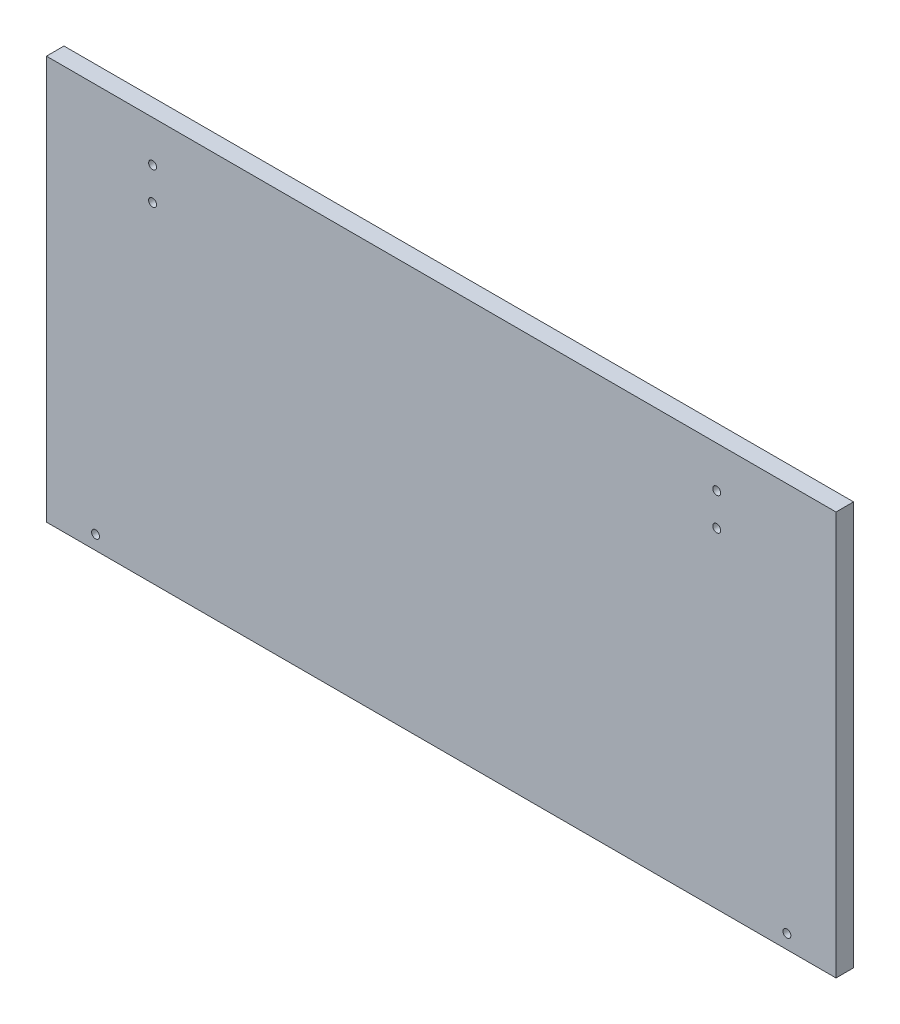
ISO-10303-21;
HEADER;
FILE_DESCRIPTION(('STEP AP214'),'2;1');
FILE_NAME('part.step','',(''),(''),'','','');
FILE_SCHEMA(('AUTOMOTIVE_DESIGN { 1 0 10303 214 1 1 1 1 }'));
ENDSEC;
DATA;
#1=APPLICATION_CONTEXT('core data for automotive mechanical design processes');
#2=APPLICATION_PROTOCOL_DEFINITION('international standard','automotive_design',2000,#1);
#3=PRODUCT_CONTEXT('',#1,'mechanical');
#4=PRODUCT('Part','Part','',(#3));
#5=PRODUCT_RELATED_PRODUCT_CATEGORY('part','',(#4));
#6=PRODUCT_DEFINITION_FORMATION('','',#4);
#7=PRODUCT_DEFINITION_CONTEXT('part definition',#1,'design');
#8=PRODUCT_DEFINITION('design','',#6,#7);
#9=PRODUCT_DEFINITION_SHAPE('','',#8);
#10=(LENGTH_UNIT() NAMED_UNIT(*) SI_UNIT(.MILLI.,.METRE.));
#11=(NAMED_UNIT(*) PLANE_ANGLE_UNIT() SI_UNIT($,.RADIAN.));
#12=(NAMED_UNIT(*) SI_UNIT($,.STERADIAN.) SOLID_ANGLE_UNIT());
#13=UNCERTAINTY_MEASURE_WITH_UNIT(LENGTH_MEASURE(1.E-05),#10,'distance_accuracy_value','');
#14=(GEOMETRIC_REPRESENTATION_CONTEXT(3) GLOBAL_UNCERTAINTY_ASSIGNED_CONTEXT((#13)) GLOBAL_UNIT_ASSIGNED_CONTEXT((#10,
#11,#12)) REPRESENTATION_CONTEXT('',''));
#15=CARTESIAN_POINT('',(0.,0.,0.));
#16=DIRECTION('',(0.,0.,1.));
#17=DIRECTION('',(1.,0.,0.));
#18=AXIS2_PLACEMENT_3D('',#15,#16,#17);
#19=CARTESIAN_POINT('',(-225.,115.,10.));
#20=DIRECTION('',(1.,0.,0.));
#21=DIRECTION('',(0.,1.,0.));
#22=AXIS2_PLACEMENT_3D('',#19,#20,#21);
#23=PLANE('',#22);
#24=DIRECTION('',(0.,-1.,0.));
#25=VECTOR('',#24,1.);
#26=CARTESIAN_POINT('',(-225.,115.,0.));
#27=LINE('',#26,#25);
#28=CARTESIAN_POINT('',(-225.,115.,0.));
#29=VERTEX_POINT('',#28);
#30=CARTESIAN_POINT('',(-225.,-115.,0.));
#31=VERTEX_POINT('',#30);
#32=EDGE_CURVE('E104',#29,#31,#27,.T.);
#33=ORIENTED_EDGE('',*,*,#32,.T.);
#34=DIRECTION('',(0.,0.,-1.));
#35=VECTOR('',#34,1.);
#36=CARTESIAN_POINT('',(-225.,-115.,10.));
#37=LINE('',#36,#35);
#38=CARTESIAN_POINT('',(-225.,-115.,10.));
#39=VERTEX_POINT('',#38);
#40=EDGE_CURVE('E11',#39,#31,#37,.T.);
#41=ORIENTED_EDGE('',*,*,#40,.F.);
#42=DIRECTION('',(0.,-1.,0.));
#43=VECTOR('',#42,1.);
#44=CARTESIAN_POINT('',(-225.,115.,10.));
#45=LINE('',#44,#43);
#46=CARTESIAN_POINT('',(-225.,115.,10.));
#47=VERTEX_POINT('',#46);
#48=EDGE_CURVE('E92',#47,#39,#45,.T.);
#49=ORIENTED_EDGE('',*,*,#48,.F.);
#50=DIRECTION('',(0.,0.,-1.));
#51=VECTOR('',#50,1.);
#52=CARTESIAN_POINT('',(-225.,115.,10.));
#53=LINE('',#52,#51);
#54=EDGE_CURVE('E100',#47,#29,#53,.T.);
#55=ORIENTED_EDGE('',*,*,#54,.T.);
#56=EDGE_LOOP('',(#33,#41,#49,#55));
#57=FACE_BOUND('',#56,.T.);
#58=ADVANCED_FACE('F41',(#57),#23,.F.);
#59=CARTESIAN_POINT('',(-225.,-115.,10.));
#60=DIRECTION('',(0.,1.,0.));
#61=DIRECTION('',(0.,0.,1.));
#62=AXIS2_PLACEMENT_3D('',#59,#60,#61);
#63=PLANE('',#62);
#64=DIRECTION('',(1.,0.,0.));
#65=VECTOR('',#64,1.);
#66=CARTESIAN_POINT('',(-225.,-115.,0.));
#67=LINE('',#66,#65);
#68=CARTESIAN_POINT('',(225.,-115.,0.));
#69=VERTEX_POINT('',#68);
#70=EDGE_CURVE('E96',#31,#69,#67,.T.);
#71=ORIENTED_EDGE('',*,*,#70,.T.);
#72=DIRECTION('',(0.,0.,-1.));
#73=VECTOR('',#72,1.);
#74=CARTESIAN_POINT('',(225.,-115.,10.));
#75=LINE('',#74,#73);
#76=CARTESIAN_POINT('',(225.,-115.,10.));
#77=VERTEX_POINT('',#76);
#78=EDGE_CURVE('E49',#77,#69,#75,.T.);
#79=ORIENTED_EDGE('',*,*,#78,.F.);
#80=DIRECTION('',(1.,0.,0.));
#81=VECTOR('',#80,1.);
#82=CARTESIAN_POINT('',(-225.,-115.,10.));
#83=LINE('',#82,#81);
#84=EDGE_CURVE('E87',#39,#77,#83,.T.);
#85=ORIENTED_EDGE('',*,*,#84,.F.);
#86=ORIENTED_EDGE('',*,*,#40,.T.);
#87=EDGE_LOOP('',(#71,#79,#85,#86));
#88=FACE_BOUND('',#87,.T.);
#89=ADVANCED_FACE('F95',(#88),#63,.F.);
#90=CARTESIAN_POINT('',(225.,115.,10.));
#91=DIRECTION('',(-1.,0.,0.));
#92=DIRECTION('',(0.,-1.,0.));
#93=AXIS2_PLACEMENT_3D('',#90,#91,#92);
#94=PLANE('',#93);
#95=DIRECTION('',(0.,1.,0.));
#96=VECTOR('',#95,1.);
#97=CARTESIAN_POINT('',(225.,115.,0.));
#98=LINE('',#97,#96);
#99=CARTESIAN_POINT('',(225.,115.,0.));
#100=VERTEX_POINT('',#99);
#101=EDGE_CURVE('E74',#69,#100,#98,.T.);
#102=ORIENTED_EDGE('',*,*,#101,.T.);
#103=DIRECTION('',(0.,0.,-1.));
#104=VECTOR('',#103,1.);
#105=CARTESIAN_POINT('',(225.,115.,10.));
#106=LINE('',#105,#104);
#107=CARTESIAN_POINT('',(225.,115.,10.));
#108=VERTEX_POINT('',#107);
#109=EDGE_CURVE('E97',#108,#100,#106,.T.);
#110=ORIENTED_EDGE('',*,*,#109,.F.);
#111=DIRECTION('',(0.,1.,0.));
#112=VECTOR('',#111,1.);
#113=CARTESIAN_POINT('',(225.,115.,10.));
#114=LINE('',#113,#112);
#115=EDGE_CURVE('E90',#77,#108,#114,.T.);
#116=ORIENTED_EDGE('',*,*,#115,.F.);
#117=ORIENTED_EDGE('',*,*,#78,.T.);
#118=EDGE_LOOP('',(#102,#110,#116,#117));
#119=FACE_BOUND('',#118,.T.);
#120=ADVANCED_FACE('F98',(#119),#94,.F.);
#121=CARTESIAN_POINT('',(-225.,115.,10.));
#122=DIRECTION('',(0.,-1.,0.));
#123=DIRECTION('',(0.,0.,-1.));
#124=AXIS2_PLACEMENT_3D('',#121,#122,#123);
#125=PLANE('',#124);
#126=DIRECTION('',(-1.,0.,0.));
#127=VECTOR('',#126,1.);
#128=CARTESIAN_POINT('',(-225.,115.,0.));
#129=LINE('',#128,#127);
#130=EDGE_CURVE('E80',#100,#29,#129,.T.);
#131=ORIENTED_EDGE('',*,*,#130,.T.);
#132=ORIENTED_EDGE('',*,*,#54,.F.);
#133=DIRECTION('',(-1.,0.,0.));
#134=VECTOR('',#133,1.);
#135=CARTESIAN_POINT('',(-225.,115.,10.));
#136=LINE('',#135,#134);
#137=EDGE_CURVE('E57',#108,#47,#136,.T.);
#138=ORIENTED_EDGE('',*,*,#137,.F.);
#139=ORIENTED_EDGE('',*,*,#109,.T.);
#140=EDGE_LOOP('',(#131,#132,#138,#139));
#141=FACE_BOUND('',#140,.T.);
#142=ADVANCED_FACE('F112',(#141),#125,.F.);
#143=CARTESIAN_POINT('',(0.,0.,10.));
#144=DIRECTION('',(0.,0.,1.));
#145=DIRECTION('',(1.,0.,0.));
#146=AXIS2_PLACEMENT_3D('',#143,#144,#145);
#147=PLANE('',#146);
#148=CARTESIAN_POINT('',(-197.,-107.,10.));
#149=DIRECTION('',(0.,0.,-1.));
#150=DIRECTION('',(-1.,0.,0.));
#151=AXIS2_PLACEMENT_3D('',#148,#149,#150);
#152=CIRCLE('',#151,2.25000000000001);
#153=CARTESIAN_POINT('',(-199.25,-107.,10.));
#154=VERTEX_POINT('',#153);
#155=EDGE_CURVE('E139',#154,#154,#152,.T.);
#156=ORIENTED_EDGE('',*,*,#155,.T.);
#157=EDGE_LOOP('',(#156));
#158=FACE_BOUND('',#157,.T.);
#159=CARTESIAN_POINT('',(197.,-107.,10.));
#160=DIRECTION('',(0.,0.,-1.));
#161=DIRECTION('',(-1.,0.,0.));
#162=AXIS2_PLACEMENT_3D('',#159,#160,#161);
#163=CIRCLE('',#162,2.25000000000001);
#164=CARTESIAN_POINT('',(194.75,-107.,10.));
#165=VERTEX_POINT('',#164);
#166=EDGE_CURVE('E142',#165,#165,#163,.T.);
#167=ORIENTED_EDGE('',*,*,#166,.T.);
#168=EDGE_LOOP('',(#167));
#169=FACE_BOUND('',#168,.T.);
#170=CARTESIAN_POINT('',(157.,73.,10.));
#171=DIRECTION('',(0.,0.,-1.));
#172=DIRECTION('',(-1.,0.,0.));
#173=AXIS2_PLACEMENT_3D('',#170,#171,#172);
#174=CIRCLE('',#173,2.25000000000001);
#175=CARTESIAN_POINT('',(154.75,73.,10.));
#176=VERTEX_POINT('',#175);
#177=EDGE_CURVE('E131',#176,#176,#174,.T.);
#178=ORIENTED_EDGE('',*,*,#177,.T.);
#179=EDGE_LOOP('',(#178));
#180=FACE_BOUND('',#179,.T.);
#181=CARTESIAN_POINT('',(-164.5,91.4999999999999,10.));
#182=DIRECTION('',(0.,0.,-1.));
#183=DIRECTION('',(-1.,0.,0.));
#184=AXIS2_PLACEMENT_3D('',#181,#182,#183);
#185=CIRCLE('',#184,2.25000000000001);
#186=CARTESIAN_POINT('',(-166.75,91.4999999999999,10.));
#187=VERTEX_POINT('',#186);
#188=EDGE_CURVE('E124',#187,#187,#185,.T.);
#189=ORIENTED_EDGE('',*,*,#188,.T.);
#190=EDGE_LOOP('',(#189));
#191=FACE_BOUND('',#190,.T.);
#192=CARTESIAN_POINT('',(-164.5,72.9999999999999,10.));
#193=DIRECTION('',(0.,0.,-1.));
#194=DIRECTION('',(-1.,0.,0.));
#195=AXIS2_PLACEMENT_3D('',#192,#193,#194);
#196=CIRCLE('',#195,2.25000000000001);
#197=CARTESIAN_POINT('',(-166.75,72.9999999999999,10.));
#198=VERTEX_POINT('',#197);
#199=EDGE_CURVE('E136',#198,#198,#196,.T.);
#200=ORIENTED_EDGE('',*,*,#199,.T.);
#201=EDGE_LOOP('',(#200));
#202=FACE_BOUND('',#201,.T.);
#203=CARTESIAN_POINT('',(157.,91.5,10.));
#204=DIRECTION('',(0.,0.,-1.));
#205=DIRECTION('',(-1.,0.,0.));
#206=AXIS2_PLACEMENT_3D('',#203,#204,#205);
#207=CIRCLE('',#206,2.25000000000001);
#208=CARTESIAN_POINT('',(154.75,91.5,10.));
#209=VERTEX_POINT('',#208);
#210=EDGE_CURVE('E107',#209,#209,#207,.T.);
#211=ORIENTED_EDGE('',*,*,#210,.T.);
#212=EDGE_LOOP('',(#211));
#213=FACE_BOUND('',#212,.T.);
#214=ORIENTED_EDGE('',*,*,#48,.T.);
#215=ORIENTED_EDGE('',*,*,#84,.T.);
#216=ORIENTED_EDGE('',*,*,#115,.T.);
#217=ORIENTED_EDGE('',*,*,#137,.T.);
#218=EDGE_LOOP('',(#214,#215,#216,#217));
#219=FACE_BOUND('',#218,.T.);
#220=ADVANCED_FACE('F88',(#158,#169,#180,#191,#202,#213,#219),#147,.T.);
#221=CARTESIAN_POINT('',(0.,0.,0.));
#222=DIRECTION('',(0.,0.,1.));
#223=DIRECTION('',(1.,0.,0.));
#224=AXIS2_PLACEMENT_3D('',#221,#222,#223);
#225=PLANE('',#224);
#226=CARTESIAN_POINT('',(-197.,-107.,0.));
#227=DIRECTION('',(0.,0.,-1.));
#228=DIRECTION('',(-1.,0.,0.));
#229=AXIS2_PLACEMENT_3D('',#226,#227,#228);
#230=CIRCLE('',#229,2.25000000000001);
#231=CARTESIAN_POINT('',(-199.25,-107.,0.));
#232=VERTEX_POINT('',#231);
#233=EDGE_CURVE('E148',#232,#232,#230,.T.);
#234=ORIENTED_EDGE('',*,*,#233,.F.);
#235=EDGE_LOOP('',(#234));
#236=FACE_BOUND('',#235,.T.);
#237=CARTESIAN_POINT('',(197.,-107.,0.));
#238=DIRECTION('',(0.,0.,-1.));
#239=DIRECTION('',(-1.,0.,0.));
#240=AXIS2_PLACEMENT_3D('',#237,#238,#239);
#241=CIRCLE('',#240,2.25000000000001);
#242=CARTESIAN_POINT('',(194.75,-107.,0.));
#243=VERTEX_POINT('',#242);
#244=EDGE_CURVE('E145',#243,#243,#241,.T.);
#245=ORIENTED_EDGE('',*,*,#244,.F.);
#246=EDGE_LOOP('',(#245));
#247=FACE_BOUND('',#246,.T.);
#248=CARTESIAN_POINT('',(157.,73.,0.));
#249=DIRECTION('',(0.,0.,-1.));
#250=DIRECTION('',(-1.,0.,0.));
#251=AXIS2_PLACEMENT_3D('',#248,#249,#250);
#252=CIRCLE('',#251,2.25000000000001);
#253=CARTESIAN_POINT('',(154.75,73.,0.));
#254=VERTEX_POINT('',#253);
#255=EDGE_CURVE('E121',#254,#254,#252,.T.);
#256=ORIENTED_EDGE('',*,*,#255,.F.);
#257=EDGE_LOOP('',(#256));
#258=FACE_BOUND('',#257,.T.);
#259=CARTESIAN_POINT('',(-164.5,91.4999999999999,0.));
#260=DIRECTION('',(0.,0.,-1.));
#261=DIRECTION('',(-1.,0.,0.));
#262=AXIS2_PLACEMENT_3D('',#259,#260,#261);
#263=CIRCLE('',#262,2.25000000000001);
#264=CARTESIAN_POINT('',(-166.75,91.4999999999999,0.));
#265=VERTEX_POINT('',#264);
#266=EDGE_CURVE('E127',#265,#265,#263,.T.);
#267=ORIENTED_EDGE('',*,*,#266,.F.);
#268=EDGE_LOOP('',(#267));
#269=FACE_BOUND('',#268,.T.);
#270=CARTESIAN_POINT('',(-164.5,72.9999999999999,0.));
#271=DIRECTION('',(0.,0.,-1.));
#272=DIRECTION('',(-1.,0.,0.));
#273=AXIS2_PLACEMENT_3D('',#270,#271,#272);
#274=CIRCLE('',#273,2.25000000000001);
#275=CARTESIAN_POINT('',(-166.75,72.9999999999999,0.));
#276=VERTEX_POINT('',#275);
#277=EDGE_CURVE('E128',#276,#276,#274,.T.);
#278=ORIENTED_EDGE('',*,*,#277,.F.);
#279=EDGE_LOOP('',(#278));
#280=FACE_BOUND('',#279,.T.);
#281=CARTESIAN_POINT('',(157.,91.5,0.));
#282=DIRECTION('',(0.,0.,-1.));
#283=DIRECTION('',(-1.,0.,0.));
#284=AXIS2_PLACEMENT_3D('',#281,#282,#283);
#285=CIRCLE('',#284,2.25000000000001);
#286=CARTESIAN_POINT('',(154.75,91.5,0.));
#287=VERTEX_POINT('',#286);
#288=EDGE_CURVE('E118',#287,#287,#285,.T.);
#289=ORIENTED_EDGE('',*,*,#288,.F.);
#290=EDGE_LOOP('',(#289));
#291=FACE_BOUND('',#290,.T.);
#292=ORIENTED_EDGE('',*,*,#32,.F.);
#293=ORIENTED_EDGE('',*,*,#130,.F.);
#294=ORIENTED_EDGE('',*,*,#101,.F.);
#295=ORIENTED_EDGE('',*,*,#70,.F.);
#296=EDGE_LOOP('',(#292,#293,#294,#295));
#297=FACE_BOUND('',#296,.T.);
#298=ADVANCED_FACE('F115',(#236,#247,#258,#269,#280,#291,#297),#225,.F.);
#299=CARTESIAN_POINT('',(157.,91.5,10.));
#300=DIRECTION('',(0.,0.,-1.));
#301=DIRECTION('',(-1.,0.,0.));
#302=AXIS2_PLACEMENT_3D('',#299,#300,#301);
#303=CYLINDRICAL_SURFACE('',#302,2.25000000000001);
#304=ORIENTED_EDGE('',*,*,#210,.F.);
#305=EDGE_LOOP('',(#304));
#306=FACE_BOUND('',#305,.T.);
#307=ORIENTED_EDGE('',*,*,#288,.T.);
#308=EDGE_LOOP('',(#307));
#309=FACE_BOUND('',#308,.T.);
#310=ADVANCED_FACE('F165',(#306,#309),#303,.F.);
#311=CARTESIAN_POINT('',(-164.5,72.9999999999999,10.));
#312=DIRECTION('',(0.,0.,-1.));
#313=DIRECTION('',(-1.,0.,0.));
#314=AXIS2_PLACEMENT_3D('',#311,#312,#313);
#315=CYLINDRICAL_SURFACE('',#314,2.25000000000001);
#316=ORIENTED_EDGE('',*,*,#199,.F.);
#317=EDGE_LOOP('',(#316));
#318=FACE_BOUND('',#317,.T.);
#319=ORIENTED_EDGE('',*,*,#277,.T.);
#320=EDGE_LOOP('',(#319));
#321=FACE_BOUND('',#320,.T.);
#322=ADVANCED_FACE('F178',(#318,#321),#315,.F.);
#323=CARTESIAN_POINT('',(-164.5,91.4999999999999,10.));
#324=DIRECTION('',(0.,0.,-1.));
#325=DIRECTION('',(-1.,0.,0.));
#326=AXIS2_PLACEMENT_3D('',#323,#324,#325);
#327=CYLINDRICAL_SURFACE('',#326,2.25000000000001);
#328=ORIENTED_EDGE('',*,*,#188,.F.);
#329=EDGE_LOOP('',(#328));
#330=FACE_BOUND('',#329,.T.);
#331=ORIENTED_EDGE('',*,*,#266,.T.);
#332=EDGE_LOOP('',(#331));
#333=FACE_BOUND('',#332,.T.);
#334=ADVANCED_FACE('F184',(#330,#333),#327,.F.);
#335=CARTESIAN_POINT('',(157.,73.,10.));
#336=DIRECTION('',(0.,0.,-1.));
#337=DIRECTION('',(-1.,0.,0.));
#338=AXIS2_PLACEMENT_3D('',#335,#336,#337);
#339=CYLINDRICAL_SURFACE('',#338,2.25000000000001);
#340=ORIENTED_EDGE('',*,*,#177,.F.);
#341=EDGE_LOOP('',(#340));
#342=FACE_BOUND('',#341,.T.);
#343=ORIENTED_EDGE('',*,*,#255,.T.);
#344=EDGE_LOOP('',(#343));
#345=FACE_BOUND('',#344,.T.);
#346=ADVANCED_FACE('F221',(#342,#345),#339,.F.);
#347=CARTESIAN_POINT('',(197.,-107.,10.));
#348=DIRECTION('',(0.,0.,-1.));
#349=DIRECTION('',(-1.,0.,0.));
#350=AXIS2_PLACEMENT_3D('',#347,#348,#349);
#351=CYLINDRICAL_SURFACE('',#350,2.25000000000001);
#352=ORIENTED_EDGE('',*,*,#166,.F.);
#353=EDGE_LOOP('',(#352));
#354=FACE_BOUND('',#353,.T.);
#355=ORIENTED_EDGE('',*,*,#244,.T.);
#356=EDGE_LOOP('',(#355));
#357=FACE_BOUND('',#356,.T.);
#358=ADVANCED_FACE('F159',(#354,#357),#351,.F.);
#359=CARTESIAN_POINT('',(-197.,-107.,10.));
#360=DIRECTION('',(0.,0.,-1.));
#361=DIRECTION('',(-1.,0.,0.));
#362=AXIS2_PLACEMENT_3D('',#359,#360,#361);
#363=CYLINDRICAL_SURFACE('',#362,2.25000000000001);
#364=ORIENTED_EDGE('',*,*,#155,.F.);
#365=EDGE_LOOP('',(#364));
#366=FACE_BOUND('',#365,.T.);
#367=ORIENTED_EDGE('',*,*,#233,.T.);
#368=EDGE_LOOP('',(#367));
#369=FACE_BOUND('',#368,.T.);
#370=ADVANCED_FACE('F156',(#366,#369),#363,.F.);
#371=CLOSED_SHELL('',(#58,#89,#120,#142,#220,#298,#310,#322,#334,#346,#358,#370));
#372=MANIFOLD_SOLID_BREP('B2',#371);
#373=ADVANCED_BREP_SHAPE_REPRESENTATION('',(#18,#372),#14);
#374=SHAPE_DEFINITION_REPRESENTATION(#9,#373);
ENDSEC;
END-ISO-10303-21;
